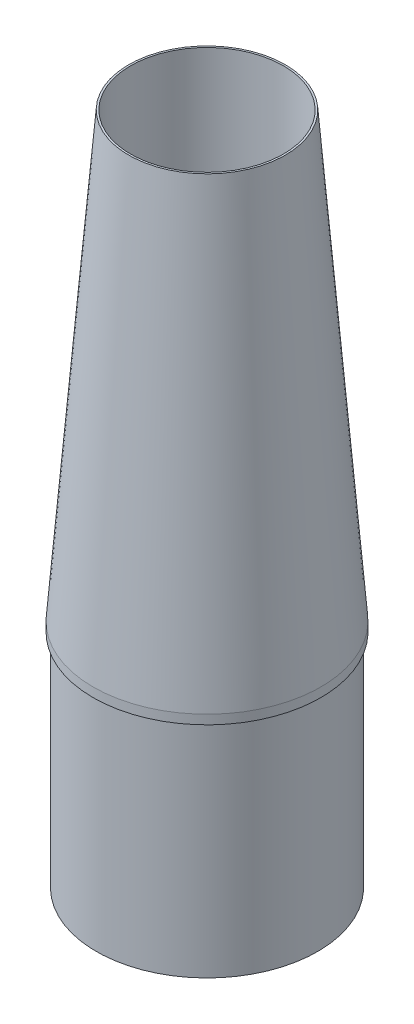
ISO-10303-21;
HEADER;
FILE_DESCRIPTION(('STEP AP214'),'2;1');
FILE_NAME('part.step','',(''),(''),'','','');
FILE_SCHEMA(('AUTOMOTIVE_DESIGN { 1 0 10303 214 1 1 1 1 }'));
ENDSEC;
DATA;
#1=APPLICATION_CONTEXT('core data for automotive mechanical design processes');
#2=APPLICATION_PROTOCOL_DEFINITION('international standard','automotive_design',2000,#1);
#3=PRODUCT_CONTEXT('',#1,'mechanical');
#4=PRODUCT('Part','Part','',(#3));
#5=PRODUCT_RELATED_PRODUCT_CATEGORY('part','',(#4));
#6=PRODUCT_DEFINITION_FORMATION('','',#4);
#7=PRODUCT_DEFINITION_CONTEXT('part definition',#1,'design');
#8=PRODUCT_DEFINITION('design','',#6,#7);
#9=PRODUCT_DEFINITION_SHAPE('','',#8);
#10=(LENGTH_UNIT() NAMED_UNIT(*) SI_UNIT(.MILLI.,.METRE.));
#11=(NAMED_UNIT(*) PLANE_ANGLE_UNIT() SI_UNIT($,.RADIAN.));
#12=(NAMED_UNIT(*) SI_UNIT($,.STERADIAN.) SOLID_ANGLE_UNIT());
#13=UNCERTAINTY_MEASURE_WITH_UNIT(LENGTH_MEASURE(1.E-05),#10,'distance_accuracy_value','');
#14=(GEOMETRIC_REPRESENTATION_CONTEXT(3) GLOBAL_UNCERTAINTY_ASSIGNED_CONTEXT((#13)) GLOBAL_UNIT_ASSIGNED_CONTEXT((#10,
#11,#12)) REPRESENTATION_CONTEXT('',''));
#15=CARTESIAN_POINT('',(0.,0.,0.));
#16=DIRECTION('',(0.,0.,1.));
#17=DIRECTION('',(1.,0.,0.));
#18=AXIS2_PLACEMENT_3D('',#15,#16,#17);
#19=CARTESIAN_POINT('',(0.,-12.7,0.));
#20=DIRECTION('',(0.,1.,0.));
#21=DIRECTION('',(0.,0.,1.));
#22=AXIS2_PLACEMENT_3D('',#19,#20,#21);
#23=PLANE('',#22);
#24=CARTESIAN_POINT('',(0.,-12.7,0.));
#25=DIRECTION('',(0.,-1.,0.));
#26=DIRECTION('',(0.,0.,-1.));
#27=AXIS2_PLACEMENT_3D('',#24,#25,#26);
#28=CIRCLE('',#27,38.1);
#29=CARTESIAN_POINT('',(0.,-12.7,-38.1));
#30=VERTEX_POINT('',#29);
#31=EDGE_CURVE('E10',#30,#30,#28,.T.);
#32=ORIENTED_EDGE('',*,*,#31,.T.);
#33=EDGE_LOOP('',(#32));
#34=FACE_BOUND('',#33,.T.);
#35=ADVANCED_FACE('F32',(#34),#23,.F.);
#36=CARTESIAN_POINT('',(0.,-32.6444333689571,0.));
#37=DIRECTION('',(0.,-1.,0.));
#38=DIRECTION('',(0.,0.,-1.));
#39=AXIS2_PLACEMENT_3D('',#36,#37,#38);
#40=CONICAL_SURFACE('',#39,61.5208865128124,0.865393753697408);
#41=ORIENTED_EDGE('',*,*,#31,.F.);
#42=EDGE_LOOP('',(#41));
#43=FACE_BOUND('',#42,.T.);
#44=CARTESIAN_POINT('',(0.,-32.6444333689571,0.));
#45=DIRECTION('',(0.,-1.,0.));
#46=DIRECTION('',(0.,0.,-1.));
#47=AXIS2_PLACEMENT_3D('',#44,#45,#46);
#48=CIRCLE('',#47,61.5208865128124);
#49=CARTESIAN_POINT('',(0.,-32.6444333689571,-61.5208865128124));
#50=VERTEX_POINT('',#49);
#51=EDGE_CURVE('E38',#50,#50,#48,.T.);
#52=ORIENTED_EDGE('',*,*,#51,.T.);
#53=EDGE_LOOP('',(#52));
#54=FACE_BOUND('',#53,.T.);
#55=ADVANCED_FACE('F91',(#43,#54),#40,.F.);
#56=CARTESIAN_POINT('',(0.,-136.541898905601,0.));
#57=DIRECTION('',(0.,-1.,0.));
#58=DIRECTION('',(0.,0.,-1.));
#59=AXIS2_PLACEMENT_3D('',#56,#57,#58);
#60=CONICAL_SURFACE('',#59,69.85,0.0799955902999576);
#61=ORIENTED_EDGE('',*,*,#51,.F.);
#62=EDGE_LOOP('',(#61));
#63=FACE_BOUND('',#62,.T.);
#64=CARTESIAN_POINT('',(0.,-136.541898905601,0.));
#65=DIRECTION('',(0.,-1.,0.));
#66=DIRECTION('',(0.,0.,-1.));
#67=AXIS2_PLACEMENT_3D('',#64,#65,#66);
#68=CIRCLE('',#67,69.85);
#69=CARTESIAN_POINT('',(0.,-136.541898905601,-69.85));
#70=VERTEX_POINT('',#69);
#71=EDGE_CURVE('E42',#70,#70,#68,.T.);
#72=ORIENTED_EDGE('',*,*,#71,.T.);
#73=EDGE_LOOP('',(#72));
#74=FACE_BOUND('',#73,.T.);
#75=ADVANCED_FACE('F95',(#63,#74),#60,.F.);
#76=CARTESIAN_POINT('',(0.,-337.711006289372,0.));
#77=DIRECTION('',(0.,-1.,0.));
#78=DIRECTION('',(0.,0.,-1.));
#79=AXIS2_PLACEMENT_3D('',#76,#77,#78);
#80=CYLINDRICAL_SURFACE('',#79,69.85);
#81=ORIENTED_EDGE('',*,*,#71,.F.);
#82=EDGE_LOOP('',(#81));
#83=FACE_BOUND('',#82,.T.);
#84=CARTESIAN_POINT('',(0.,-306.076350158758,0.));
#85=DIRECTION('',(0.,-1.,0.));
#86=DIRECTION('',(0.,0.,-1.));
#87=AXIS2_PLACEMENT_3D('',#84,#85,#86);
#88=CIRCLE('',#87,69.85);
#89=CARTESIAN_POINT('',(0.,-306.076350158758,-69.85));
#90=VERTEX_POINT('',#89);
#91=EDGE_CURVE('E46',#90,#90,#88,.T.);
#92=ORIENTED_EDGE('',*,*,#91,.T.);
#93=EDGE_LOOP('',(#92));
#94=FACE_BOUND('',#93,.T.);
#95=ADVANCED_FACE('F100',(#83,#94),#80,.F.);
#96=CARTESIAN_POINT('',(-76.2,-306.076350158758,0.));
#97=DIRECTION('',(0.,1.,0.));
#98=DIRECTION('',(0.,0.,1.));
#99=AXIS2_PLACEMENT_3D('',#96,#97,#98);
#100=PLANE('',#99);
#101=ORIENTED_EDGE('',*,*,#91,.F.);
#102=EDGE_LOOP('',(#101));
#103=FACE_BOUND('',#102,.T.);
#104=CARTESIAN_POINT('',(0.,-306.076350158758,0.));
#105=DIRECTION('',(0.,-1.,0.));
#106=DIRECTION('',(0.,0.,-1.));
#107=AXIS2_PLACEMENT_3D('',#104,#105,#106);
#108=CIRCLE('',#107,76.2);
#109=CARTESIAN_POINT('',(0.,-306.076350158758,-76.2));
#110=VERTEX_POINT('',#109);
#111=EDGE_CURVE('E51',#110,#110,#108,.T.);
#112=ORIENTED_EDGE('',*,*,#111,.T.);
#113=EDGE_LOOP('',(#112));
#114=FACE_BOUND('',#113,.T.);
#115=ADVANCED_FACE('F106',(#103,#114),#100,.F.);
#116=CARTESIAN_POINT('',(0.,-337.711006289372,0.));
#117=DIRECTION('',(0.,-1.,0.));
#118=DIRECTION('',(0.,0.,-1.));
#119=AXIS2_PLACEMENT_3D('',#116,#117,#118);
#120=CYLINDRICAL_SURFACE('',#119,76.2);
#121=ORIENTED_EDGE('',*,*,#111,.F.);
#122=EDGE_LOOP('',(#121));
#123=FACE_BOUND('',#122,.T.);
#124=CARTESIAN_POINT('',(0.,-153.676350158758,0.));
#125=DIRECTION('',(0.,-1.,0.));
#126=DIRECTION('',(0.,0.,-1.));
#127=AXIS2_PLACEMENT_3D('',#124,#125,#126);
#128=CIRCLE('',#127,76.2);
#129=CARTESIAN_POINT('',(0.,-153.676350158758,-76.2));
#130=VERTEX_POINT('',#129);
#131=EDGE_CURVE('E54',#130,#130,#128,.T.);
#132=ORIENTED_EDGE('',*,*,#131,.T.);
#133=EDGE_LOOP('',(#132));
#134=FACE_BOUND('',#133,.T.);
#135=ADVANCED_FACE('F110',(#123,#134),#120,.T.);
#136=CARTESIAN_POINT('',(-78.359,-153.676350158758,0.));
#137=DIRECTION('',(0.,1.,0.));
#138=DIRECTION('',(0.,0.,1.));
#139=AXIS2_PLACEMENT_3D('',#136,#137,#138);
#140=PLANE('',#139);
#141=ORIENTED_EDGE('',*,*,#131,.F.);
#142=EDGE_LOOP('',(#141));
#143=FACE_BOUND('',#142,.T.);
#144=CARTESIAN_POINT('',(0.,-153.676350158758,0.));
#145=DIRECTION('',(0.,-1.,0.));
#146=DIRECTION('',(0.,0.,-1.));
#147=AXIS2_PLACEMENT_3D('',#144,#145,#146);
#148=CIRCLE('',#147,78.359);
#149=CARTESIAN_POINT('',(0.,-153.676350158758,-78.359));
#150=VERTEX_POINT('',#149);
#151=EDGE_CURVE('E57',#150,#150,#148,.T.);
#152=ORIENTED_EDGE('',*,*,#151,.T.);
#153=EDGE_LOOP('',(#152));
#154=FACE_BOUND('',#153,.T.);
#155=ADVANCED_FACE('F114',(#143,#154),#140,.F.);
#156=CARTESIAN_POINT('',(0.,-337.711006289372,0.));
#157=DIRECTION('',(0.,-1.,0.));
#158=DIRECTION('',(0.,0.,-1.));
#159=AXIS2_PLACEMENT_3D('',#156,#157,#158);
#160=CYLINDRICAL_SURFACE('',#159,78.359);
#161=ORIENTED_EDGE('',*,*,#151,.F.);
#162=EDGE_LOOP('',(#161));
#163=FACE_BOUND('',#162,.T.);
#164=CARTESIAN_POINT('',(0.,-147.326350158758,0.));
#165=DIRECTION('',(0.,-1.,0.));
#166=DIRECTION('',(0.,0.,-1.));
#167=AXIS2_PLACEMENT_3D('',#164,#165,#166);
#168=CIRCLE('',#167,78.359);
#169=CARTESIAN_POINT('',(0.,-147.326350158758,-78.359));
#170=VERTEX_POINT('',#169);
#171=EDGE_CURVE('E60',#170,#170,#168,.T.);
#172=ORIENTED_EDGE('',*,*,#171,.T.);
#173=EDGE_LOOP('',(#172));
#174=FACE_BOUND('',#173,.T.);
#175=ADVANCED_FACE('F118',(#163,#174),#160,.T.);
#176=CARTESIAN_POINT('',(0.,157.473649841242,0.));
#177=DIRECTION('',(0.,-1.,0.));
#178=DIRECTION('',(0.,0.,-1.));
#179=AXIS2_PLACEMENT_3D('',#176,#177,#178);
#180=CONICAL_SURFACE('',#179,53.9242,0.0799955902999577);
#181=ORIENTED_EDGE('',*,*,#171,.F.);
#182=EDGE_LOOP('',(#181));
#183=FACE_BOUND('',#182,.T.);
#184=CARTESIAN_POINT('',(0.,157.473649841242,0.));
#185=DIRECTION('',(0.,-1.,0.));
#186=DIRECTION('',(0.,0.,-1.));
#187=AXIS2_PLACEMENT_3D('',#184,#185,#186);
#188=CIRCLE('',#187,53.9242);
#189=CARTESIAN_POINT('',(0.,157.473649841242,-53.9242));
#190=VERTEX_POINT('',#189);
#191=EDGE_CURVE('E63',#190,#190,#188,.T.);
#192=ORIENTED_EDGE('',*,*,#191,.T.);
#193=EDGE_LOOP('',(#192));
#194=FACE_BOUND('',#193,.T.);
#195=ADVANCED_FACE('F122',(#183,#194),#180,.T.);
#196=CARTESIAN_POINT('',(-52.6542,157.473649841242,0.));
#197=DIRECTION('',(0.,-1.,0.));
#198=DIRECTION('',(0.,0.,-1.));
#199=AXIS2_PLACEMENT_3D('',#196,#197,#198);
#200=PLANE('',#199);
#201=ORIENTED_EDGE('',*,*,#191,.F.);
#202=EDGE_LOOP('',(#201));
#203=FACE_BOUND('',#202,.T.);
#204=CARTESIAN_POINT('',(0.,157.473649841242,0.));
#205=DIRECTION('',(0.,-1.,0.));
#206=DIRECTION('',(0.,0.,-1.));
#207=AXIS2_PLACEMENT_3D('',#204,#205,#206);
#208=CIRCLE('',#207,52.6542);
#209=CARTESIAN_POINT('',(0.,157.473649841242,-52.6542));
#210=VERTEX_POINT('',#209);
#211=EDGE_CURVE('E66',#210,#210,#208,.T.);
#212=ORIENTED_EDGE('',*,*,#211,.T.);
#213=EDGE_LOOP('',(#212));
#214=FACE_BOUND('',#213,.T.);
#215=ADVANCED_FACE('F126',(#203,#214),#200,.F.);
#216=CARTESIAN_POINT('',(0.,-337.711006289372,0.));
#217=DIRECTION('',(0.,-1.,0.));
#218=DIRECTION('',(0.,0.,-1.));
#219=AXIS2_PLACEMENT_3D('',#216,#217,#218);
#220=CYLINDRICAL_SURFACE('',#219,52.6542);
#221=ORIENTED_EDGE('',*,*,#211,.F.);
#222=EDGE_LOOP('',(#221));
#223=FACE_BOUND('',#222,.T.);
#224=CARTESIAN_POINT('',(0.,30.48,0.));
#225=DIRECTION('',(0.,-1.,0.));
#226=DIRECTION('',(0.,0.,-1.));
#227=AXIS2_PLACEMENT_3D('',#224,#225,#226);
#228=CIRCLE('',#227,52.6542);
#229=CARTESIAN_POINT('',(0.,30.48,-52.6542));
#230=VERTEX_POINT('',#229);
#231=EDGE_CURVE('E69',#230,#230,#228,.T.);
#232=ORIENTED_EDGE('',*,*,#231,.T.);
#233=EDGE_LOOP('',(#232));
#234=FACE_BOUND('',#233,.T.);
#235=ADVANCED_FACE('F130',(#223,#234),#220,.F.);
#236=CARTESIAN_POINT('',(-34.925,30.48,0.));
#237=DIRECTION('',(0.,-1.,0.));
#238=DIRECTION('',(0.,0.,-1.));
#239=AXIS2_PLACEMENT_3D('',#236,#237,#238);
#240=PLANE('',#239);
#241=ORIENTED_EDGE('',*,*,#231,.F.);
#242=EDGE_LOOP('',(#241));
#243=FACE_BOUND('',#242,.T.);
#244=CARTESIAN_POINT('',(0.,30.48,0.));
#245=DIRECTION('',(0.,-1.,0.));
#246=DIRECTION('',(0.,0.,-1.));
#247=AXIS2_PLACEMENT_3D('',#244,#245,#246);
#248=CIRCLE('',#247,34.925);
#249=CARTESIAN_POINT('',(0.,30.48,-34.925));
#250=VERTEX_POINT('',#249);
#251=EDGE_CURVE('E72',#250,#250,#248,.T.);
#252=ORIENTED_EDGE('',*,*,#251,.T.);
#253=EDGE_LOOP('',(#252));
#254=FACE_BOUND('',#253,.T.);
#255=ADVANCED_FACE('F87',(#243,#254),#240,.F.);
#256=CARTESIAN_POINT('',(0.,-337.711006289372,0.));
#257=DIRECTION('',(0.,-1.,0.));
#258=DIRECTION('',(0.,0.,-1.));
#259=AXIS2_PLACEMENT_3D('',#256,#257,#258);
#260=CYLINDRICAL_SURFACE('',#259,34.925);
#261=ORIENTED_EDGE('',*,*,#251,.F.);
#262=EDGE_LOOP('',(#261));
#263=FACE_BOUND('',#262,.T.);
#264=CARTESIAN_POINT('',(0.,0.,0.));
#265=DIRECTION('',(0.,-1.,0.));
#266=DIRECTION('',(0.,0.,-1.));
#267=AXIS2_PLACEMENT_3D('',#264,#265,#266);
#268=CIRCLE('',#267,34.925);
#269=CARTESIAN_POINT('',(0.,0.,-34.925));
#270=VERTEX_POINT('',#269);
#271=EDGE_CURVE('E75',#270,#270,#268,.T.);
#272=ORIENTED_EDGE('',*,*,#271,.T.);
#273=EDGE_LOOP('',(#272));
#274=FACE_BOUND('',#273,.T.);
#275=ADVANCED_FACE('F79',(#263,#274),#260,.F.);
#276=CARTESIAN_POINT('',(0.,0.,0.));
#277=DIRECTION('',(0.,-1.,0.));
#278=DIRECTION('',(0.,0.,-1.));
#279=AXIS2_PLACEMENT_3D('',#276,#277,#278);
#280=PLANE('',#279);
#281=ORIENTED_EDGE('',*,*,#271,.F.);
#282=EDGE_LOOP('',(#281));
#283=FACE_BOUND('',#282,.T.);
#284=ADVANCED_FACE('F81',(#283),#280,.F.);
#285=CLOSED_SHELL('',(#35,#55,#75,#95,#115,#135,#155,#175,#195,#215,#235,#255,#275,#284));
#286=MANIFOLD_SOLID_BREP('B2',#285);
#287=ADVANCED_BREP_SHAPE_REPRESENTATION('',(#18,#286),#14);
#288=SHAPE_DEFINITION_REPRESENTATION(#9,#287);
ENDSEC;
END-ISO-10303-21;
